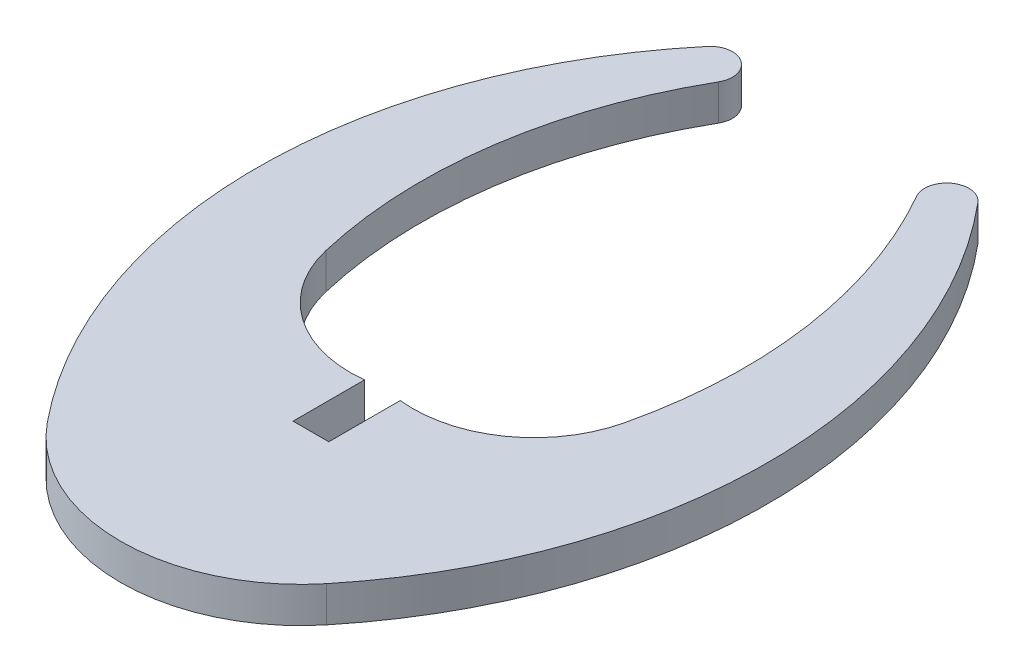
ISO-10303-21;
HEADER;
FILE_DESCRIPTION(('STEP AP214'),'2;1');
FILE_NAME('part.step','',(''),(''),'','','');
FILE_SCHEMA(('AUTOMOTIVE_DESIGN { 1 0 10303 214 1 1 1 1 }'));
ENDSEC;
DATA;
#1=APPLICATION_CONTEXT('core data for automotive mechanical design processes');
#2=APPLICATION_PROTOCOL_DEFINITION('international standard','automotive_design',2000,#1);
#3=PRODUCT_CONTEXT('',#1,'mechanical');
#4=PRODUCT('Part','Part','',(#3));
#5=PRODUCT_RELATED_PRODUCT_CATEGORY('part','',(#4));
#6=PRODUCT_DEFINITION_FORMATION('','',#4);
#7=PRODUCT_DEFINITION_CONTEXT('part definition',#1,'design');
#8=PRODUCT_DEFINITION('design','',#6,#7);
#9=PRODUCT_DEFINITION_SHAPE('','',#8);
#10=(LENGTH_UNIT() NAMED_UNIT(*) SI_UNIT(.MILLI.,.METRE.));
#11=(NAMED_UNIT(*) PLANE_ANGLE_UNIT() SI_UNIT($,.RADIAN.));
#12=(NAMED_UNIT(*) SI_UNIT($,.STERADIAN.) SOLID_ANGLE_UNIT());
#13=UNCERTAINTY_MEASURE_WITH_UNIT(LENGTH_MEASURE(1.E-05),#10,'distance_accuracy_value','');
#14=(GEOMETRIC_REPRESENTATION_CONTEXT(3) GLOBAL_UNCERTAINTY_ASSIGNED_CONTEXT((#13)) GLOBAL_UNIT_ASSIGNED_CONTEXT((#10,
#11,#12)) REPRESENTATION_CONTEXT('',''));
#15=CARTESIAN_POINT('',(0.,0.,0.));
#16=DIRECTION('',(0.,0.,1.));
#17=DIRECTION('',(1.,0.,0.));
#18=AXIS2_PLACEMENT_3D('',#15,#16,#17);
#19=CARTESIAN_POINT('',(-41813.701197,3.,-18401.092482));
#20=DIRECTION('',(-0.999999945672355,0.,0.000329629012599163));
#21=DIRECTION('',(0.000329629012599164,0.,0.999999945672356));
#22=AXIS2_PLACEMENT_3D('',#19,#20,#21);
#23=PLANE('',#22);
#24=DIRECTION('',(-0.000329629012599163,0.,-0.999999945672356));
#25=VECTOR('',#24,1.);
#26=CARTESIAN_POINT('',(-41813.701197,0.,-18401.092482));
#27=LINE('',#26,#25);
#28=CARTESIAN_POINT('',(-41813.699219,0.,-18395.091797));
#29=VERTEX_POINT('',#28);
#30=CARTESIAN_POINT('',(-41813.701197,0.,-18401.092482));
#31=VERTEX_POINT('',#30);
#32=EDGE_CURVE('E155',#29,#31,#27,.T.);
#33=ORIENTED_EDGE('',*,*,#32,.T.);
#34=DIRECTION('',(0.,-1.,0.));
#35=VECTOR('',#34,1.);
#36=CARTESIAN_POINT('',(-41813.701197,3.,-18401.092482));
#37=LINE('',#36,#35);
#38=CARTESIAN_POINT('',(-41813.701197,3.,-18401.092482));
#39=VERTEX_POINT('',#38);
#40=EDGE_CURVE('E11',#39,#31,#37,.T.);
#41=ORIENTED_EDGE('',*,*,#40,.F.);
#42=DIRECTION('',(-0.000329629012599163,0.,-0.999999945672356));
#43=VECTOR('',#42,1.);
#44=CARTESIAN_POINT('',(-41813.701197,3.,-18401.092482));
#45=LINE('',#44,#43);
#46=CARTESIAN_POINT('',(-41813.699219,3.,-18395.091797));
#47=VERTEX_POINT('',#46);
#48=EDGE_CURVE('E177',#47,#39,#45,.T.);
#49=ORIENTED_EDGE('',*,*,#48,.F.);
#50=DIRECTION('',(0.,-1.,0.));
#51=VECTOR('',#50,1.);
#52=CARTESIAN_POINT('',(-41813.699219,3.,-18395.091797));
#53=LINE('',#52,#51);
#54=EDGE_CURVE('E151',#47,#29,#53,.T.);
#55=ORIENTED_EDGE('',*,*,#54,.T.);
#56=EDGE_LOOP('',(#33,#41,#49,#55));
#57=FACE_BOUND('',#56,.T.);
#58=ADVANCED_FACE('F35',(#57),#23,.F.);
#59=CARTESIAN_POINT('',(-41814.8306231987,3.,-18411.1923649552));
#60=DIRECTION('',(0.,-1.,0.));
#61=DIRECTION('',(0.,0.,-1.));
#62=AXIS2_PLACEMENT_3D('',#59,#60,#61);
#63=CYLINDRICAL_SURFACE('',#62,10.1628361812985);
#64=CARTESIAN_POINT('',(-41814.8306231987,0.,-18411.1923649552));
#65=DIRECTION('',(0.,-1.,0.));
#66=DIRECTION('',(0.,0.,1.));
#67=AXIS2_PLACEMENT_3D('',#64,#65,#66);
#68=CIRCLE('',#67,10.1628361812985);
#69=CARTESIAN_POINT('',(-41824.726251,0.,-18408.877243));
#70=VERTEX_POINT('',#69);
#71=EDGE_CURVE('E158',#31,#70,#68,.T.);
#72=ORIENTED_EDGE('',*,*,#71,.T.);
#73=DIRECTION('',(0.,-1.,0.));
#74=VECTOR('',#73,1.);
#75=CARTESIAN_POINT('',(-41824.726251,3.,-18408.877243));
#76=LINE('',#75,#74);
#77=CARTESIAN_POINT('',(-41824.726251,3.,-18408.877243));
#78=VERTEX_POINT('',#77);
#79=EDGE_CURVE('E43',#78,#70,#76,.T.);
#80=ORIENTED_EDGE('',*,*,#79,.F.);
#81=CARTESIAN_POINT('',(-41814.8306231987,3.,-18411.1923649552));
#82=DIRECTION('',(0.,-1.,0.));
#83=DIRECTION('',(0.,0.,1.));
#84=AXIS2_PLACEMENT_3D('',#81,#82,#83);
#85=CIRCLE('',#84,10.1628361812985);
#86=EDGE_CURVE('E106',#39,#78,#85,.T.);
#87=ORIENTED_EDGE('',*,*,#86,.F.);
#88=ORIENTED_EDGE('',*,*,#40,.T.);
#89=EDGE_LOOP('',(#72,#80,#87,#88));
#90=FACE_BOUND('',#89,.T.);
#91=ADVANCED_FACE('F255',(#90),#63,.F.);
#92=CARTESIAN_POINT('',(-41786.1759224062,3.,-18417.9052855944));
#93=DIRECTION('',(0.,-1.,0.));
#94=DIRECTION('',(0.,0.,-1.));
#95=AXIS2_PLACEMENT_3D('',#92,#93,#94);
#96=CYLINDRICAL_SURFACE('',#95,39.5933502974017);
#97=CARTESIAN_POINT('',(-41786.1759224062,0.,-18417.9052855944));
#98=DIRECTION('',(0.,-1.,0.));
#99=DIRECTION('',(0.,0.,1.));
#100=AXIS2_PLACEMENT_3D('',#97,#98,#99);
#101=CIRCLE('',#100,39.5933502974017);
#102=CARTESIAN_POINT('',(-41820.511795,0.,-18437.620286));
#103=VERTEX_POINT('',#102);
#104=EDGE_CURVE('E160',#70,#103,#101,.T.);
#105=ORIENTED_EDGE('',*,*,#104,.T.);
#106=DIRECTION('',(0.,-1.,0.));
#107=VECTOR('',#106,1.);
#108=CARTESIAN_POINT('',(-41820.511795,3.,-18437.620286));
#109=LINE('',#108,#107);
#110=CARTESIAN_POINT('',(-41820.511795,3.,-18437.620286));
#111=VERTEX_POINT('',#110);
#112=EDGE_CURVE('E196',#111,#103,#109,.T.);
#113=ORIENTED_EDGE('',*,*,#112,.F.);
#114=CARTESIAN_POINT('',(-41786.1759224062,3.,-18417.9052855944));
#115=DIRECTION('',(0.,-1.,0.));
#116=DIRECTION('',(0.,0.,1.));
#117=AXIS2_PLACEMENT_3D('',#114,#115,#116);
#118=CIRCLE('',#117,39.5933502974017);
#119=EDGE_CURVE('E204',#78,#111,#118,.T.);
#120=ORIENTED_EDGE('',*,*,#119,.F.);
#121=ORIENTED_EDGE('',*,*,#79,.T.);
#122=EDGE_LOOP('',(#105,#113,#120,#121));
#123=FACE_BOUND('',#122,.T.);
#124=ADVANCED_FACE('F202',(#123),#96,.F.);
#125=CARTESIAN_POINT('',(-41822.1254187934,3.,-18438.5452138622));
#126=DIRECTION('',(0.,-1.,0.));
#127=DIRECTION('',(0.,0.,-1.));
#128=AXIS2_PLACEMENT_3D('',#125,#126,#127);
#129=CYLINDRICAL_SURFACE('',#128,1.85991217450167);
#130=CARTESIAN_POINT('',(-41822.1254187934,0.,-18438.5452138622));
#131=DIRECTION('',(0.,1.,0.));
#132=DIRECTION('',(0.,0.,1.));
#133=AXIS2_PLACEMENT_3D('',#130,#131,#132);
#134=CIRCLE('',#133,1.85991217450167);
#135=CARTESIAN_POINT('',(-41823.551759,0.,-18439.738875));
#136=VERTEX_POINT('',#135);
#137=EDGE_CURVE('E162',#103,#136,#134,.T.);
#138=ORIENTED_EDGE('',*,*,#137,.T.);
#139=DIRECTION('',(0.,-1.,0.));
#140=VECTOR('',#139,1.);
#141=CARTESIAN_POINT('',(-41823.551759,3.,-18439.738875));
#142=LINE('',#141,#140);
#143=CARTESIAN_POINT('',(-41823.551759,3.,-18439.738875));
#144=VERTEX_POINT('',#143);
#145=EDGE_CURVE('E193',#144,#136,#142,.T.);
#146=ORIENTED_EDGE('',*,*,#145,.F.);
#147=CARTESIAN_POINT('',(-41822.1254187934,3.,-18438.5452138622));
#148=DIRECTION('',(0.,1.,0.));
#149=DIRECTION('',(0.,0.,1.));
#150=AXIS2_PLACEMENT_3D('',#147,#148,#149);
#151=CIRCLE('',#150,1.85991217450167);
#152=EDGE_CURVE('E222',#111,#144,#151,.T.);
#153=ORIENTED_EDGE('',*,*,#152,.F.);
#154=ORIENTED_EDGE('',*,*,#112,.T.);
#155=EDGE_LOOP('',(#138,#146,#153,#154));
#156=FACE_BOUND('',#155,.T.);
#157=ADVANCED_FACE('F213',(#156),#129,.T.);
#158=CARTESIAN_POINT('',(-41790.429705956,3.,-18411.9835689357));
#159=DIRECTION('',(0.,-1.,0.));
#160=DIRECTION('',(0.,0.,-1.));
#161=AXIS2_PLACEMENT_3D('',#158,#159,#160);
#162=CYLINDRICAL_SURFACE('',#161,43.2137410156993);
#163=CARTESIAN_POINT('',(-41790.429705956,0.,-18411.9835689357));
#164=DIRECTION('',(0.,1.,0.));
#165=DIRECTION('',(0.,0.,1.));
#166=AXIS2_PLACEMENT_3D('',#163,#164,#165);
#167=CIRCLE('',#166,43.2137410156993);
#168=CARTESIAN_POINT('',(-41823.929996,0.,-18384.685987));
#169=VERTEX_POINT('',#168);
#170=EDGE_CURVE('E164',#136,#169,#167,.T.);
#171=ORIENTED_EDGE('',*,*,#170,.T.);
#172=DIRECTION('',(0.,-1.,0.));
#173=VECTOR('',#172,1.);
#174=CARTESIAN_POINT('',(-41823.929996,3.,-18384.685987));
#175=LINE('',#174,#173);
#176=CARTESIAN_POINT('',(-41823.929996,3.,-18384.685987));
#177=VERTEX_POINT('',#176);
#178=EDGE_CURVE('E190',#177,#169,#175,.T.);
#179=ORIENTED_EDGE('',*,*,#178,.F.);
#180=CARTESIAN_POINT('',(-41790.429705956,3.,-18411.9835689357));
#181=DIRECTION('',(0.,1.,0.));
#182=DIRECTION('',(0.,0.,1.));
#183=AXIS2_PLACEMENT_3D('',#180,#181,#182);
#184=CIRCLE('',#183,43.2137410156993);
#185=EDGE_CURVE('E219',#144,#177,#184,.T.);
#186=ORIENTED_EDGE('',*,*,#185,.F.);
#187=ORIENTED_EDGE('',*,*,#145,.T.);
#188=EDGE_LOOP('',(#171,#179,#186,#187));
#189=FACE_BOUND('',#188,.T.);
#190=ADVANCED_FACE('F217',(#189),#162,.T.);
#191=CARTESIAN_POINT('',(-41812.2019220539,3.,-18394.2441408633));
#192=DIRECTION('',(0.,-1.,0.));
#193=DIRECTION('',(0.,0.,-1.));
#194=AXIS2_PLACEMENT_3D('',#191,#192,#193);
#195=CYLINDRICAL_SURFACE('',#194,15.1296405695025);
#196=CARTESIAN_POINT('',(-41812.2019220539,0.,-18394.2441408633));
#197=DIRECTION('',(0.,1.,0.));
#198=DIRECTION('',(0.,0.,1.));
#199=AXIS2_PLACEMENT_3D('',#196,#197,#198);
#200=CIRCLE('',#199,15.1296405695025);
#201=CARTESIAN_POINT('',(-41800.475939,0.,-18384.683422));
#202=VERTEX_POINT('',#201);
#203=EDGE_CURVE('E166',#169,#202,#200,.T.);
#204=ORIENTED_EDGE('',*,*,#203,.T.);
#205=DIRECTION('',(0.,-1.,0.));
#206=VECTOR('',#205,1.);
#207=CARTESIAN_POINT('',(-41800.475939,3.,-18384.683422));
#208=LINE('',#207,#206);
#209=CARTESIAN_POINT('',(-41800.475939,3.,-18384.683422));
#210=VERTEX_POINT('',#209);
#211=EDGE_CURVE('E187',#210,#202,#208,.T.);
#212=ORIENTED_EDGE('',*,*,#211,.F.);
#213=CARTESIAN_POINT('',(-41812.2019220539,3.,-18394.2441408633));
#214=DIRECTION('',(0.,1.,0.));
#215=DIRECTION('',(0.,0.,1.));
#216=AXIS2_PLACEMENT_3D('',#213,#214,#215);
#217=CIRCLE('',#216,15.1296405695025);
#218=EDGE_CURVE('E221',#177,#210,#217,.T.);
#219=ORIENTED_EDGE('',*,*,#218,.F.);
#220=ORIENTED_EDGE('',*,*,#178,.T.);
#221=EDGE_LOOP('',(#204,#212,#219,#220));
#222=FACE_BOUND('',#221,.T.);
#223=ADVANCED_FACE('F268',(#222),#195,.T.);
#224=CARTESIAN_POINT('',(-41833.964830848,3.,-18411.9901837322));
#225=DIRECTION('',(0.,-1.,0.));
#226=DIRECTION('',(0.,0.,-1.));
#227=AXIS2_PLACEMENT_3D('',#224,#225,#226);
#228=CYLINDRICAL_SURFACE('',#227,43.2107060056016);
#229=CARTESIAN_POINT('',(-41833.964830848,0.,-18411.9901837322));
#230=DIRECTION('',(0.,1.,0.));
#231=DIRECTION('',(0.,0.,1.));
#232=AXIS2_PLACEMENT_3D('',#229,#230,#231);
#233=CIRCLE('',#232,43.2107060056016);
#234=CARTESIAN_POINT('',(-41800.837363,0.,-18439.7343000001));
#235=VERTEX_POINT('',#234);
#236=EDGE_CURVE('E168',#202,#235,#233,.T.);
#237=ORIENTED_EDGE('',*,*,#236,.T.);
#238=DIRECTION('',(0.,-1.,0.));
#239=VECTOR('',#238,1.);
#240=CARTESIAN_POINT('',(-41800.837363,3.,-18439.7343000001));
#241=LINE('',#240,#239);
#242=CARTESIAN_POINT('',(-41800.837363,3.,-18439.7343000001));
#243=VERTEX_POINT('',#242);
#244=EDGE_CURVE('E184',#243,#235,#241,.T.);
#245=ORIENTED_EDGE('',*,*,#244,.F.);
#246=CARTESIAN_POINT('',(-41833.964830848,3.,-18411.9901837322));
#247=DIRECTION('',(0.,1.,0.));
#248=DIRECTION('',(0.,0.,1.));
#249=AXIS2_PLACEMENT_3D('',#246,#247,#248);
#250=CIRCLE('',#249,43.2107060056016);
#251=EDGE_CURVE('E224',#210,#243,#250,.T.);
#252=ORIENTED_EDGE('',*,*,#251,.F.);
#253=ORIENTED_EDGE('',*,*,#211,.T.);
#254=EDGE_LOOP('',(#237,#245,#252,#253));
#255=FACE_BOUND('',#254,.T.);
#256=ADVANCED_FACE('F271',(#255),#228,.T.);
#257=CARTESIAN_POINT('',(-41802.2600175128,3.,-18438.5402495896));
#258=DIRECTION('',(0.,-1.,0.));
#259=DIRECTION('',(0.,0.,-1.));
#260=AXIS2_PLACEMENT_3D('',#257,#258,#259);
#261=CYLINDRICAL_SURFACE('',#260,1.8573374074923);
#262=CARTESIAN_POINT('',(-41802.2600175128,0.,-18438.5402495896));
#263=DIRECTION('',(0.,1.,0.));
#264=DIRECTION('',(0.,0.,1.));
#265=AXIS2_PLACEMENT_3D('',#262,#263,#264);
#266=CIRCLE('',#265,1.8573374074923);
#267=CARTESIAN_POINT('',(-41803.871416,0.,-18437.616617));
#268=VERTEX_POINT('',#267);
#269=EDGE_CURVE('E170',#235,#268,#266,.T.);
#270=ORIENTED_EDGE('',*,*,#269,.T.);
#271=DIRECTION('',(0.,-1.,0.));
#272=VECTOR('',#271,1.);
#273=CARTESIAN_POINT('',(-41803.871416,3.,-18437.616617));
#274=LINE('',#273,#272);
#275=CARTESIAN_POINT('',(-41803.871416,3.,-18437.616617));
#276=VERTEX_POINT('',#275);
#277=EDGE_CURVE('E181',#276,#268,#274,.T.);
#278=ORIENTED_EDGE('',*,*,#277,.F.);
#279=CARTESIAN_POINT('',(-41802.2600175128,3.,-18438.5402495896));
#280=DIRECTION('',(0.,1.,0.));
#281=DIRECTION('',(0.,0.,1.));
#282=AXIS2_PLACEMENT_3D('',#279,#280,#281);
#283=CIRCLE('',#282,1.8573374074923);
#284=EDGE_CURVE('E230',#243,#276,#283,.T.);
#285=ORIENTED_EDGE('',*,*,#284,.F.);
#286=ORIENTED_EDGE('',*,*,#244,.T.);
#287=EDGE_LOOP('',(#270,#278,#285,#286));
#288=FACE_BOUND('',#287,.T.);
#289=ADVANCED_FACE('F236',(#288),#261,.T.);
#290=CARTESIAN_POINT('',(-41838.2155407807,3.,-18417.9188290808));
#291=DIRECTION('',(0.,-1.,0.));
#292=DIRECTION('',(0.,0.,-1.));
#293=AXIS2_PLACEMENT_3D('',#290,#291,#292);
#294=CYLINDRICAL_SURFACE('',#293,39.5919405417073);
#295=CARTESIAN_POINT('',(-41838.2155407807,0.,-18417.9188290808));
#296=DIRECTION('',(0.,-1.,0.));
#297=DIRECTION('',(0.,0.,1.));
#298=AXIS2_PLACEMENT_3D('',#295,#296,#297);
#299=CIRCLE('',#298,39.5919405417073);
#300=CARTESIAN_POINT('',(-41799.670382,0.,-18408.874909));
#301=VERTEX_POINT('',#300);
#302=EDGE_CURVE('E172',#268,#301,#299,.T.);
#303=ORIENTED_EDGE('',*,*,#302,.T.);
#304=DIRECTION('',(0.,-1.,0.));
#305=VECTOR('',#304,1.);
#306=CARTESIAN_POINT('',(-41799.670382,3.,-18408.874909));
#307=LINE('',#306,#305);
#308=CARTESIAN_POINT('',(-41799.670382,3.,-18408.874909));
#309=VERTEX_POINT('',#308);
#310=EDGE_CURVE('E146',#309,#301,#307,.T.);
#311=ORIENTED_EDGE('',*,*,#310,.F.);
#312=CARTESIAN_POINT('',(-41838.2155407807,3.,-18417.9188290808));
#313=DIRECTION('',(0.,-1.,0.));
#314=DIRECTION('',(0.,0.,1.));
#315=AXIS2_PLACEMENT_3D('',#312,#313,#314);
#316=CIRCLE('',#315,39.5919405417073);
#317=EDGE_CURVE('E137',#276,#309,#316,.T.);
#318=ORIENTED_EDGE('',*,*,#317,.F.);
#319=ORIENTED_EDGE('',*,*,#277,.T.);
#320=EDGE_LOOP('',(#303,#311,#318,#319));
#321=FACE_BOUND('',#320,.T.);
#322=ADVANCED_FACE('F240',(#321),#294,.F.);
#323=CARTESIAN_POINT('',(-41809.566960393,3.,-18411.1929677618));
#324=DIRECTION('',(0.,-1.,0.));
#325=DIRECTION('',(0.,0.,-1.));
#326=AXIS2_PLACEMENT_3D('',#323,#324,#325);
#327=CYLINDRICAL_SURFACE('',#326,10.1644311356979);
#328=CARTESIAN_POINT('',(-41809.566960393,0.,-18411.1929677618));
#329=DIRECTION('',(0.,-1.,0.));
#330=DIRECTION('',(0.,0.,1.));
#331=AXIS2_PLACEMENT_3D('',#328,#329,#330);
#332=CIRCLE('',#331,10.1644311356979);
#333=CARTESIAN_POINT('',(-41810.699219,0.,-18401.091797));
#334=VERTEX_POINT('',#333);
#335=EDGE_CURVE('E145',#301,#334,#332,.T.);
#336=ORIENTED_EDGE('',*,*,#335,.T.);
#337=DIRECTION('',(0.,-1.,0.));
#338=VECTOR('',#337,1.);
#339=CARTESIAN_POINT('',(-41810.699219,3.,-18401.091797));
#340=LINE('',#339,#338);
#341=CARTESIAN_POINT('',(-41810.699219,3.,-18401.091797));
#342=VERTEX_POINT('',#341);
#343=EDGE_CURVE('E142',#342,#334,#340,.T.);
#344=ORIENTED_EDGE('',*,*,#343,.F.);
#345=CARTESIAN_POINT('',(-41809.566960393,3.,-18411.1929677618));
#346=DIRECTION('',(0.,-1.,0.));
#347=DIRECTION('',(0.,0.,1.));
#348=AXIS2_PLACEMENT_3D('',#345,#346,#347);
#349=CIRCLE('',#348,10.1644311356979);
#350=EDGE_CURVE('E131',#309,#342,#349,.T.);
#351=ORIENTED_EDGE('',*,*,#350,.F.);
#352=ORIENTED_EDGE('',*,*,#310,.T.);
#353=EDGE_LOOP('',(#336,#344,#351,#352));
#354=FACE_BOUND('',#353,.T.);
#355=ADVANCED_FACE('F143',(#354),#327,.F.);
#356=CARTESIAN_POINT('',(-41810.699219,3.,-18395.091797));
#357=DIRECTION('',(1.,0.,0.));
#358=DIRECTION('',(0.,0.,-1.));
#359=AXIS2_PLACEMENT_3D('',#356,#357,#358);
#360=PLANE('',#359);
#361=DIRECTION('',(0.,0.,1.));
#362=VECTOR('',#361,1.);
#363=CARTESIAN_POINT('',(-41810.699219,0.,-18395.091797));
#364=LINE('',#363,#362);
#365=CARTESIAN_POINT('',(-41810.699219,0.,-18395.091797));
#366=VERTEX_POINT('',#365);
#367=EDGE_CURVE('E92',#334,#366,#364,.T.);
#368=ORIENTED_EDGE('',*,*,#367,.T.);
#369=DIRECTION('',(0.,-1.,0.));
#370=VECTOR('',#369,1.);
#371=CARTESIAN_POINT('',(-41810.699219,3.,-18395.091797));
#372=LINE('',#371,#370);
#373=CARTESIAN_POINT('',(-41810.699219,3.,-18395.091797));
#374=VERTEX_POINT('',#373);
#375=EDGE_CURVE('E147',#374,#366,#372,.T.);
#376=ORIENTED_EDGE('',*,*,#375,.F.);
#377=DIRECTION('',(0.,0.,1.));
#378=VECTOR('',#377,1.);
#379=CARTESIAN_POINT('',(-41810.699219,3.,-18395.091797));
#380=LINE('',#379,#378);
#381=EDGE_CURVE('E135',#342,#374,#380,.T.);
#382=ORIENTED_EDGE('',*,*,#381,.F.);
#383=ORIENTED_EDGE('',*,*,#343,.T.);
#384=EDGE_LOOP('',(#368,#376,#382,#383));
#385=FACE_BOUND('',#384,.T.);
#386=ADVANCED_FACE('F149',(#385),#360,.F.);
#387=CARTESIAN_POINT('',(-41813.699219,3.,-18395.091797));
#388=DIRECTION('',(0.,0.,1.));
#389=DIRECTION('',(1.,0.,0.));
#390=AXIS2_PLACEMENT_3D('',#387,#388,#389);
#391=PLANE('',#390);
#392=DIRECTION('',(-1.,0.,0.));
#393=VECTOR('',#392,1.);
#394=CARTESIAN_POINT('',(-41813.699219,0.,-18395.091797));
#395=LINE('',#394,#393);
#396=EDGE_CURVE('E98',#366,#29,#395,.T.);
#397=ORIENTED_EDGE('',*,*,#396,.T.);
#398=ORIENTED_EDGE('',*,*,#54,.F.);
#399=DIRECTION('',(-1.,0.,0.));
#400=VECTOR('',#399,1.);
#401=CARTESIAN_POINT('',(-41813.699219,3.,-18395.091797));
#402=LINE('',#401,#400);
#403=EDGE_CURVE('E51',#374,#47,#402,.T.);
#404=ORIENTED_EDGE('',*,*,#403,.F.);
#405=ORIENTED_EDGE('',*,*,#375,.T.);
#406=EDGE_LOOP('',(#397,#398,#404,#405));
#407=FACE_BOUND('',#406,.T.);
#408=ADVANCED_FACE('F244',(#407),#391,.F.);
#409=CARTESIAN_POINT('',(-41809.566960393,3.,-18411.1929677618));
#410=DIRECTION('',(0.,1.,0.));
#411=DIRECTION('',(0.,0.,1.));
#412=AXIS2_PLACEMENT_3D('',#409,#410,#411);
#413=PLANE('',#412);
#414=ORIENTED_EDGE('',*,*,#48,.T.);
#415=ORIENTED_EDGE('',*,*,#86,.T.);
#416=ORIENTED_EDGE('',*,*,#119,.T.);
#417=ORIENTED_EDGE('',*,*,#152,.T.);
#418=ORIENTED_EDGE('',*,*,#185,.T.);
#419=ORIENTED_EDGE('',*,*,#218,.T.);
#420=ORIENTED_EDGE('',*,*,#251,.T.);
#421=ORIENTED_EDGE('',*,*,#284,.T.);
#422=ORIENTED_EDGE('',*,*,#317,.T.);
#423=ORIENTED_EDGE('',*,*,#350,.T.);
#424=ORIENTED_EDGE('',*,*,#381,.T.);
#425=ORIENTED_EDGE('',*,*,#403,.T.);
#426=EDGE_LOOP('',(#414,#415,#416,#417,#418,#419,#420,#421,#422,#423,#424,#425));
#427=FACE_BOUND('',#426,.T.);
#428=ADVANCED_FACE('F133',(#427),#413,.T.);
#429=CARTESIAN_POINT('',(-41809.566960393,0.,-18411.1929677618));
#430=DIRECTION('',(0.,1.,0.));
#431=DIRECTION('',(0.,0.,1.));
#432=AXIS2_PLACEMENT_3D('',#429,#430,#431);
#433=PLANE('',#432);
#434=ORIENTED_EDGE('',*,*,#32,.F.);
#435=ORIENTED_EDGE('',*,*,#396,.F.);
#436=ORIENTED_EDGE('',*,*,#367,.F.);
#437=ORIENTED_EDGE('',*,*,#335,.F.);
#438=ORIENTED_EDGE('',*,*,#302,.F.);
#439=ORIENTED_EDGE('',*,*,#269,.F.);
#440=ORIENTED_EDGE('',*,*,#236,.F.);
#441=ORIENTED_EDGE('',*,*,#203,.F.);
#442=ORIENTED_EDGE('',*,*,#170,.F.);
#443=ORIENTED_EDGE('',*,*,#137,.F.);
#444=ORIENTED_EDGE('',*,*,#104,.F.);
#445=ORIENTED_EDGE('',*,*,#71,.F.);
#446=EDGE_LOOP('',(#434,#435,#436,#437,#438,#439,#440,#441,#442,#443,#444,#445));
#447=FACE_BOUND('',#446,.T.);
#448=ADVANCED_FACE('F208',(#447),#433,.F.);
#449=CLOSED_SHELL('',(#58,#91,#124,#157,#190,#223,#256,#289,#322,#355,#386,#408,#428,#448));
#450=MANIFOLD_SOLID_BREP('B2',#449);
#451=ADVANCED_BREP_SHAPE_REPRESENTATION('',(#18,#450),#14);
#452=SHAPE_DEFINITION_REPRESENTATION(#9,#451);
ENDSEC;
END-ISO-10303-21;
